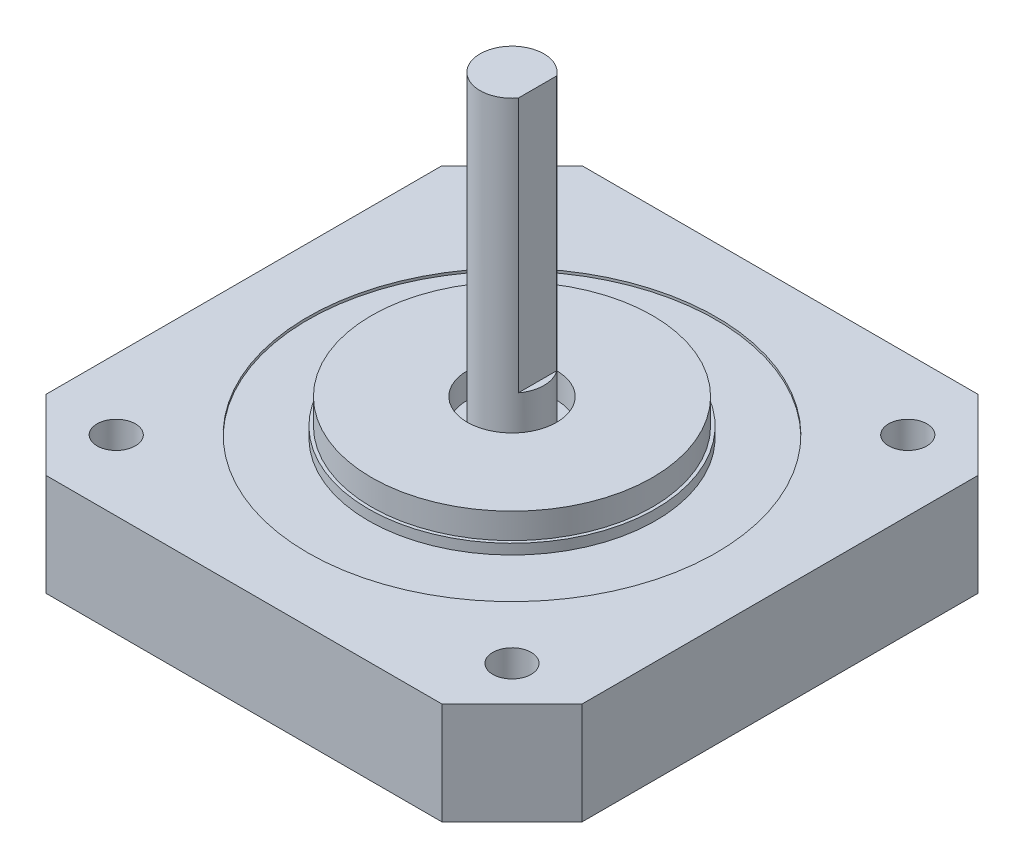
ISO-10303-21;
HEADER;
FILE_DESCRIPTION(('STEP AP214'),'2;1');
FILE_NAME('part.step','',(''),(''),'','','');
FILE_SCHEMA(('AUTOMOTIVE_DESIGN { 1 0 10303 214 1 1 1 1 }'));
ENDSEC;
DATA;
#1=APPLICATION_CONTEXT('core data for automotive mechanical design processes');
#2=APPLICATION_PROTOCOL_DEFINITION('international standard','automotive_design',2000,#1);
#3=PRODUCT_CONTEXT('',#1,'mechanical');
#4=PRODUCT('Part','Part','',(#3));
#5=PRODUCT_RELATED_PRODUCT_CATEGORY('part','',(#4));
#6=PRODUCT_DEFINITION_FORMATION('','',#4);
#7=PRODUCT_DEFINITION_CONTEXT('part definition',#1,'design');
#8=PRODUCT_DEFINITION('design','',#6,#7);
#9=PRODUCT_DEFINITION_SHAPE('','',#8);
#10=(LENGTH_UNIT() NAMED_UNIT(*) SI_UNIT(.MILLI.,.METRE.));
#11=(NAMED_UNIT(*) PLANE_ANGLE_UNIT() SI_UNIT($,.RADIAN.));
#12=(NAMED_UNIT(*) SI_UNIT($,.STERADIAN.) SOLID_ANGLE_UNIT());
#13=UNCERTAINTY_MEASURE_WITH_UNIT(LENGTH_MEASURE(1.E-05),#10,'distance_accuracy_value','');
#14=(GEOMETRIC_REPRESENTATION_CONTEXT(3) GLOBAL_UNCERTAINTY_ASSIGNED_CONTEXT((#13)) GLOBAL_UNIT_ASSIGNED_CONTEXT((#10,
#11,#12)) REPRESENTATION_CONTEXT('',''));
#15=CARTESIAN_POINT('',(0.,0.,0.));
#16=DIRECTION('',(0.,0.,1.));
#17=DIRECTION('',(1.,0.,0.));
#18=AXIS2_PLACEMENT_3D('',#15,#16,#17);
#19=CARTESIAN_POINT('',(-15.5,8.,15.5));
#20=DIRECTION('',(0.,-1.,0.));
#21=DIRECTION('',(0.,0.,-1.));
#22=AXIS2_PLACEMENT_3D('',#19,#20,#21);
#23=CYLINDRICAL_SURFACE('',#22,1.5);
#24=CARTESIAN_POINT('',(-15.5,8.,15.5));
#25=DIRECTION('',(0.,-1.,0.));
#26=DIRECTION('',(0.,0.,1.));
#27=AXIS2_PLACEMENT_3D('',#24,#25,#26);
#28=CIRCLE('',#27,1.5);
#29=CARTESIAN_POINT('',(-15.5,8.,17.));
#30=VERTEX_POINT('',#29);
#31=EDGE_CURVE('E166',#30,#30,#28,.T.);
#32=ORIENTED_EDGE('',*,*,#31,.F.);
#33=EDGE_LOOP('',(#32));
#34=FACE_BOUND('',#33,.T.);
#35=CARTESIAN_POINT('',(-15.5,1.,15.5));
#36=DIRECTION('',(0.,-1.,0.));
#37=DIRECTION('',(0.,0.,-1.));
#38=AXIS2_PLACEMENT_3D('',#35,#36,#37);
#39=CIRCLE('',#38,1.5);
#40=CARTESIAN_POINT('',(-15.5,1.,14.));
#41=VERTEX_POINT('',#40);
#42=EDGE_CURVE('E11',#41,#41,#39,.F.);
#43=ORIENTED_EDGE('',*,*,#42,.F.);
#44=EDGE_LOOP('',(#43));
#45=FACE_BOUND('',#44,.T.);
#46=ADVANCED_FACE('F35',(#34,#45),#23,.F.);
#47=CARTESIAN_POINT('',(15.5,8.,-15.5));
#48=DIRECTION('',(0.,-1.,0.));
#49=DIRECTION('',(0.,0.,-1.));
#50=AXIS2_PLACEMENT_3D('',#47,#48,#49);
#51=CYLINDRICAL_SURFACE('',#50,1.5);
#52=CARTESIAN_POINT('',(15.5,8.,-15.5));
#53=DIRECTION('',(0.,-1.,0.));
#54=DIRECTION('',(0.,0.,1.));
#55=AXIS2_PLACEMENT_3D('',#52,#53,#54);
#56=CIRCLE('',#55,1.5);
#57=CARTESIAN_POINT('',(15.5,8.,-14.));
#58=VERTEX_POINT('',#57);
#59=EDGE_CURVE('E167',#58,#58,#56,.T.);
#60=ORIENTED_EDGE('',*,*,#59,.F.);
#61=EDGE_LOOP('',(#60));
#62=FACE_BOUND('',#61,.T.);
#63=CARTESIAN_POINT('',(15.5,1.,-15.5));
#64=DIRECTION('',(0.,-1.,0.));
#65=DIRECTION('',(0.,0.,-1.));
#66=AXIS2_PLACEMENT_3D('',#63,#64,#65);
#67=CIRCLE('',#66,1.5);
#68=CARTESIAN_POINT('',(15.5,1.,-17.));
#69=VERTEX_POINT('',#68);
#70=EDGE_CURVE('E43',#69,#69,#67,.F.);
#71=ORIENTED_EDGE('',*,*,#70,.F.);
#72=EDGE_LOOP('',(#71));
#73=FACE_BOUND('',#72,.T.);
#74=ADVANCED_FACE('F241',(#62,#73),#51,.F.);
#75=CARTESIAN_POINT('',(-15.5,8.,-15.5));
#76=DIRECTION('',(0.,-1.,0.));
#77=DIRECTION('',(0.,0.,-1.));
#78=AXIS2_PLACEMENT_3D('',#75,#76,#77);
#79=CYLINDRICAL_SURFACE('',#78,1.5);
#80=CARTESIAN_POINT('',(-15.5,8.,-15.5));
#81=DIRECTION('',(0.,-1.,0.));
#82=DIRECTION('',(0.,0.,-1.));
#83=AXIS2_PLACEMENT_3D('',#80,#81,#82);
#84=CIRCLE('',#83,1.5);
#85=CARTESIAN_POINT('',(-15.5,8.,-17.));
#86=VERTEX_POINT('',#85);
#87=EDGE_CURVE('E170',#86,#86,#84,.T.);
#88=ORIENTED_EDGE('',*,*,#87,.F.);
#89=EDGE_LOOP('',(#88));
#90=FACE_BOUND('',#89,.T.);
#91=CARTESIAN_POINT('',(-15.5,1.,-15.5));
#92=DIRECTION('',(0.,-1.,0.));
#93=DIRECTION('',(0.,0.,-1.));
#94=AXIS2_PLACEMENT_3D('',#91,#92,#93);
#95=CIRCLE('',#94,1.5);
#96=CARTESIAN_POINT('',(-15.5,1.,-17.));
#97=VERTEX_POINT('',#96);
#98=EDGE_CURVE('E234',#97,#97,#95,.F.);
#99=ORIENTED_EDGE('',*,*,#98,.F.);
#100=EDGE_LOOP('',(#99));
#101=FACE_BOUND('',#100,.T.);
#102=ADVANCED_FACE('F243',(#90,#101),#79,.F.);
#103=CARTESIAN_POINT('',(15.5,8.,15.5));
#104=DIRECTION('',(0.,-1.,0.));
#105=DIRECTION('',(0.,0.,-1.));
#106=AXIS2_PLACEMENT_3D('',#103,#104,#105);
#107=CYLINDRICAL_SURFACE('',#106,1.5);
#108=CARTESIAN_POINT('',(15.5,8.,15.5));
#109=DIRECTION('',(0.,-1.,0.));
#110=DIRECTION('',(0.,0.,-1.));
#111=AXIS2_PLACEMENT_3D('',#108,#109,#110);
#112=CIRCLE('',#111,1.5);
#113=CARTESIAN_POINT('',(15.5,8.,14.));
#114=VERTEX_POINT('',#113);
#115=EDGE_CURVE('E161',#114,#114,#112,.T.);
#116=ORIENTED_EDGE('',*,*,#115,.F.);
#117=EDGE_LOOP('',(#116));
#118=FACE_BOUND('',#117,.T.);
#119=CARTESIAN_POINT('',(15.5,1.,15.5));
#120=DIRECTION('',(0.,-1.,0.));
#121=DIRECTION('',(0.,0.,-1.));
#122=AXIS2_PLACEMENT_3D('',#119,#120,#121);
#123=CIRCLE('',#122,1.5);
#124=CARTESIAN_POINT('',(15.5,1.,14.));
#125=VERTEX_POINT('',#124);
#126=EDGE_CURVE('E151',#125,#125,#123,.F.);
#127=ORIENTED_EDGE('',*,*,#126,.F.);
#128=EDGE_LOOP('',(#127));
#129=FACE_BOUND('',#128,.T.);
#130=ADVANCED_FACE('F250',(#118,#129),#107,.F.);
#131=CARTESIAN_POINT('',(21.,8.,-21.));
#132=DIRECTION('',(-1.,0.,0.));
#133=DIRECTION('',(0.,0.,1.));
#134=AXIS2_PLACEMENT_3D('',#131,#132,#133);
#135=PLANE('',#134);
#136=DIRECTION('',(0.,0.,-1.));
#137=VECTOR('',#136,1.);
#138=CARTESIAN_POINT('',(21.,0.,-21.));
#139=LINE('',#138,#137);
#140=CARTESIAN_POINT('',(21.,0.,15.5));
#141=VERTEX_POINT('',#140);
#142=CARTESIAN_POINT('',(21.,0.,-15.5));
#143=VERTEX_POINT('',#142);
#144=EDGE_CURVE('E175',#141,#143,#139,.T.);
#145=ORIENTED_EDGE('',*,*,#144,.T.);
#146=DIRECTION('',(0.,1.,0.));
#147=VECTOR('',#146,1.);
#148=CARTESIAN_POINT('',(21.,8.,-15.5));
#149=LINE('',#148,#147);
#150=CARTESIAN_POINT('',(21.,8.,-15.5));
#151=VERTEX_POINT('',#150);
#152=EDGE_CURVE('E226',#143,#151,#149,.T.);
#153=ORIENTED_EDGE('',*,*,#152,.T.);
#154=DIRECTION('',(0.,0.,-1.));
#155=VECTOR('',#154,1.);
#156=CARTESIAN_POINT('',(21.,8.,-21.));
#157=LINE('',#156,#155);
#158=CARTESIAN_POINT('',(21.,8.,15.5));
#159=VERTEX_POINT('',#158);
#160=EDGE_CURVE('E176',#159,#151,#157,.T.);
#161=ORIENTED_EDGE('',*,*,#160,.F.);
#162=DIRECTION('',(0.,-1.,0.));
#163=VECTOR('',#162,1.);
#164=CARTESIAN_POINT('',(21.,8.,15.5));
#165=LINE('',#164,#163);
#166=EDGE_CURVE('E223',#159,#141,#165,.T.);
#167=ORIENTED_EDGE('',*,*,#166,.T.);
#168=EDGE_LOOP('',(#145,#153,#161,#167));
#169=FACE_BOUND('',#168,.T.);
#170=ADVANCED_FACE('F278',(#169),#135,.F.);
#171=CARTESIAN_POINT('',(-21.,8.,-21.));
#172=DIRECTION('',(0.,0.,1.));
#173=DIRECTION('',(1.,0.,0.));
#174=AXIS2_PLACEMENT_3D('',#171,#172,#173);
#175=PLANE('',#174);
#176=DIRECTION('',(-1.,0.,0.));
#177=VECTOR('',#176,1.);
#178=CARTESIAN_POINT('',(-21.,0.,-21.));
#179=LINE('',#178,#177);
#180=CARTESIAN_POINT('',(15.5,0.,-21.));
#181=VERTEX_POINT('',#180);
#182=CARTESIAN_POINT('',(-15.5,0.,-21.));
#183=VERTEX_POINT('',#182);
#184=EDGE_CURVE('E191',#181,#183,#179,.T.);
#185=ORIENTED_EDGE('',*,*,#184,.T.);
#186=DIRECTION('',(0.,1.,0.));
#187=VECTOR('',#186,1.);
#188=CARTESIAN_POINT('',(-15.5,8.,-21.));
#189=LINE('',#188,#187);
#190=CARTESIAN_POINT('',(-15.5,8.,-21.));
#191=VERTEX_POINT('',#190);
#192=EDGE_CURVE('E213',#183,#191,#189,.T.);
#193=ORIENTED_EDGE('',*,*,#192,.T.);
#194=DIRECTION('',(-1.,0.,0.));
#195=VECTOR('',#194,1.);
#196=CARTESIAN_POINT('',(-21.,8.,-21.));
#197=LINE('',#196,#195);
#198=CARTESIAN_POINT('',(15.5,8.,-21.));
#199=VERTEX_POINT('',#198);
#200=EDGE_CURVE('E179',#199,#191,#197,.T.);
#201=ORIENTED_EDGE('',*,*,#200,.F.);
#202=DIRECTION('',(0.,-1.,0.));
#203=VECTOR('',#202,1.);
#204=CARTESIAN_POINT('',(15.5,8.,-21.));
#205=LINE('',#204,#203);
#206=EDGE_CURVE('E210',#199,#181,#205,.T.);
#207=ORIENTED_EDGE('',*,*,#206,.T.);
#208=EDGE_LOOP('',(#185,#193,#201,#207));
#209=FACE_BOUND('',#208,.T.);
#210=ADVANCED_FACE('F274',(#209),#175,.F.);
#211=CARTESIAN_POINT('',(-21.,8.,-21.));
#212=DIRECTION('',(1.,0.,0.));
#213=DIRECTION('',(0.,0.,-1.));
#214=AXIS2_PLACEMENT_3D('',#211,#212,#213);
#215=PLANE('',#214);
#216=DIRECTION('',(0.,0.,1.));
#217=VECTOR('',#216,1.);
#218=CARTESIAN_POINT('',(-21.,8.,-21.));
#219=LINE('',#218,#217);
#220=CARTESIAN_POINT('',(-21.,8.,-15.5));
#221=VERTEX_POINT('',#220);
#222=CARTESIAN_POINT('',(-21.,8.,15.5));
#223=VERTEX_POINT('',#222);
#224=EDGE_CURVE('E183',#221,#223,#219,.T.);
#225=ORIENTED_EDGE('',*,*,#224,.F.);
#226=DIRECTION('',(0.,-1.,0.));
#227=VECTOR('',#226,1.);
#228=CARTESIAN_POINT('',(-21.,8.,-15.5));
#229=LINE('',#228,#227);
#230=CARTESIAN_POINT('',(-21.,0.,-15.5));
#231=VERTEX_POINT('',#230);
#232=EDGE_CURVE('E199',#221,#231,#229,.T.);
#233=ORIENTED_EDGE('',*,*,#232,.T.);
#234=DIRECTION('',(0.,0.,1.));
#235=VECTOR('',#234,1.);
#236=CARTESIAN_POINT('',(-21.,0.,-21.));
#237=LINE('',#236,#235);
#238=CARTESIAN_POINT('',(-21.,0.,15.5));
#239=VERTEX_POINT('',#238);
#240=EDGE_CURVE('E194',#231,#239,#237,.T.);
#241=ORIENTED_EDGE('',*,*,#240,.T.);
#242=DIRECTION('',(0.,1.,0.));
#243=VECTOR('',#242,1.);
#244=CARTESIAN_POINT('',(-21.,8.,15.5));
#245=LINE('',#244,#243);
#246=EDGE_CURVE('E188',#239,#223,#245,.T.);
#247=ORIENTED_EDGE('',*,*,#246,.T.);
#248=EDGE_LOOP('',(#225,#233,#241,#247));
#249=FACE_BOUND('',#248,.T.);
#250=ADVANCED_FACE('F271',(#249),#215,.F.);
#251=CARTESIAN_POINT('',(-21.,8.,21.));
#252=DIRECTION('',(0.,0.,-1.));
#253=DIRECTION('',(-1.,0.,0.));
#254=AXIS2_PLACEMENT_3D('',#251,#252,#253);
#255=PLANE('',#254);
#256=DIRECTION('',(1.,0.,0.));
#257=VECTOR('',#256,1.);
#258=CARTESIAN_POINT('',(-21.,0.,21.));
#259=LINE('',#258,#257);
#260=CARTESIAN_POINT('',(-15.5,0.,21.));
#261=VERTEX_POINT('',#260);
#262=CARTESIAN_POINT('',(15.5,0.,21.));
#263=VERTEX_POINT('',#262);
#264=EDGE_CURVE('E180',#261,#263,#259,.T.);
#265=ORIENTED_EDGE('',*,*,#264,.T.);
#266=DIRECTION('',(0.,1.,0.));
#267=VECTOR('',#266,1.);
#268=CARTESIAN_POINT('',(15.5,8.,21.));
#269=LINE('',#268,#267);
#270=CARTESIAN_POINT('',(15.5,8.,21.));
#271=VERTEX_POINT('',#270);
#272=EDGE_CURVE('E58',#263,#271,#269,.T.);
#273=ORIENTED_EDGE('',*,*,#272,.T.);
#274=DIRECTION('',(1.,0.,0.));
#275=VECTOR('',#274,1.);
#276=CARTESIAN_POINT('',(-21.,8.,21.));
#277=LINE('',#276,#275);
#278=CARTESIAN_POINT('',(-15.5,8.,21.));
#279=VERTEX_POINT('',#278);
#280=EDGE_CURVE('E186',#279,#271,#277,.T.);
#281=ORIENTED_EDGE('',*,*,#280,.F.);
#282=DIRECTION('',(0.,-1.,0.));
#283=VECTOR('',#282,1.);
#284=CARTESIAN_POINT('',(-15.5,8.,21.));
#285=LINE('',#284,#283);
#286=EDGE_CURVE('E228',#279,#261,#285,.T.);
#287=ORIENTED_EDGE('',*,*,#286,.T.);
#288=EDGE_LOOP('',(#265,#273,#281,#287));
#289=FACE_BOUND('',#288,.T.);
#290=ADVANCED_FACE('F263',(#289),#255,.F.);
#291=CARTESIAN_POINT('',(0.,8.,0.));
#292=DIRECTION('',(0.,1.,0.));
#293=DIRECTION('',(0.,0.,1.));
#294=AXIS2_PLACEMENT_3D('',#291,#292,#293);
#295=PLANE('',#294);
#296=CARTESIAN_POINT('',(0.,8.,0.));
#297=DIRECTION('',(0.,1.,0.));
#298=DIRECTION('',(0.,0.,1.));
#299=AXIS2_PLACEMENT_3D('',#296,#297,#298);
#300=CIRCLE('',#299,16.);
#301=CARTESIAN_POINT('',(0.,8.,16.));
#302=VERTEX_POINT('',#301);
#303=EDGE_CURVE('E155',#302,#302,#300,.T.);
#304=ORIENTED_EDGE('',*,*,#303,.F.);
#305=EDGE_LOOP('',(#304));
#306=FACE_BOUND('',#305,.T.);
#307=ORIENTED_EDGE('',*,*,#59,.T.);
#308=EDGE_LOOP('',(#307));
#309=FACE_BOUND('',#308,.T.);
#310=ORIENTED_EDGE('',*,*,#31,.T.);
#311=EDGE_LOOP('',(#310));
#312=FACE_BOUND('',#311,.T.);
#313=ORIENTED_EDGE('',*,*,#115,.T.);
#314=EDGE_LOOP('',(#313));
#315=FACE_BOUND('',#314,.T.);
#316=ORIENTED_EDGE('',*,*,#87,.T.);
#317=EDGE_LOOP('',(#316));
#318=FACE_BOUND('',#317,.T.);
#319=ORIENTED_EDGE('',*,*,#200,.T.);
#320=DIRECTION('',(0.707106781186549,0.,-0.707106781186546));
#321=VECTOR('',#320,1.);
#322=CARTESIAN_POINT('',(-18.25,8.,-18.25));
#323=LINE('',#322,#321);
#324=EDGE_CURVE('E221',#191,#221,#323,.F.);
#325=ORIENTED_EDGE('',*,*,#324,.T.);
#326=ORIENTED_EDGE('',*,*,#224,.T.);
#327=DIRECTION('',(-0.707106781186546,0.,-0.707106781186549));
#328=VECTOR('',#327,1.);
#329=CARTESIAN_POINT('',(-18.25,8.,18.25));
#330=LINE('',#329,#328);
#331=EDGE_CURVE('E215',#223,#279,#330,.F.);
#332=ORIENTED_EDGE('',*,*,#331,.T.);
#333=ORIENTED_EDGE('',*,*,#280,.T.);
#334=DIRECTION('',(-0.707106781186549,0.,0.707106781186546));
#335=VECTOR('',#334,1.);
#336=CARTESIAN_POINT('',(18.25,8.,18.25));
#337=LINE('',#336,#335);
#338=EDGE_CURVE('E217',#271,#159,#337,.F.);
#339=ORIENTED_EDGE('',*,*,#338,.T.);
#340=ORIENTED_EDGE('',*,*,#160,.T.);
#341=DIRECTION('',(0.707106781186546,0.,0.707106781186549));
#342=VECTOR('',#341,1.);
#343=CARTESIAN_POINT('',(18.25,8.,-18.25));
#344=LINE('',#343,#342);
#345=EDGE_CURVE('E219',#151,#199,#344,.F.);
#346=ORIENTED_EDGE('',*,*,#345,.T.);
#347=EDGE_LOOP('',(#319,#325,#326,#332,#333,#339,#340,#346));
#348=FACE_BOUND('',#347,.T.);
#349=ADVANCED_FACE('F259',(#306,#309,#312,#315,#318,#348),#295,.T.);
#350=CARTESIAN_POINT('',(0.,0.,0.));
#351=DIRECTION('',(0.,1.,0.));
#352=DIRECTION('',(0.,0.,1.));
#353=AXIS2_PLACEMENT_3D('',#350,#351,#352);
#354=PLANE('',#353);
#355=ORIENTED_EDGE('',*,*,#240,.F.);
#356=DIRECTION('',(-0.707106781186549,0.,0.707106781186546));
#357=VECTOR('',#356,1.);
#358=CARTESIAN_POINT('',(-21.,0.,-15.5));
#359=LINE('',#358,#357);
#360=EDGE_CURVE('E208',#231,#183,#359,.F.);
#361=ORIENTED_EDGE('',*,*,#360,.T.);
#362=ORIENTED_EDGE('',*,*,#184,.F.);
#363=DIRECTION('',(-0.707106781186546,0.,-0.707106781186549));
#364=VECTOR('',#363,1.);
#365=CARTESIAN_POINT('',(15.5,0.,-21.));
#366=LINE('',#365,#364);
#367=EDGE_CURVE('E206',#181,#143,#366,.F.);
#368=ORIENTED_EDGE('',*,*,#367,.T.);
#369=ORIENTED_EDGE('',*,*,#144,.F.);
#370=DIRECTION('',(0.707106781186549,0.,-0.707106781186546));
#371=VECTOR('',#370,1.);
#372=CARTESIAN_POINT('',(21.,0.,15.5));
#373=LINE('',#372,#371);
#374=EDGE_CURVE('E204',#141,#263,#373,.F.);
#375=ORIENTED_EDGE('',*,*,#374,.T.);
#376=ORIENTED_EDGE('',*,*,#264,.F.);
#377=DIRECTION('',(0.707106781186546,0.,0.707106781186549));
#378=VECTOR('',#377,1.);
#379=CARTESIAN_POINT('',(-15.5,0.,21.));
#380=LINE('',#379,#378);
#381=EDGE_CURVE('E202',#261,#239,#380,.F.);
#382=ORIENTED_EDGE('',*,*,#381,.T.);
#383=EDGE_LOOP('',(#355,#361,#362,#368,#369,#375,#376,#382));
#384=FACE_BOUND('',#383,.T.);
#385=ADVANCED_FACE('F262',(#384),#354,.F.);
#386=CARTESIAN_POINT('',(-21.,8.,-15.5));
#387=DIRECTION('',(0.707106781186546,0.,0.707106781186549));
#388=DIRECTION('',(0.,-1.,0.));
#389=AXIS2_PLACEMENT_3D('',#386,#387,#388);
#390=PLANE('',#389);
#391=ORIENTED_EDGE('',*,*,#324,.F.);
#392=ORIENTED_EDGE('',*,*,#192,.F.);
#393=ORIENTED_EDGE('',*,*,#360,.F.);
#394=ORIENTED_EDGE('',*,*,#232,.F.);
#395=EDGE_LOOP('',(#391,#392,#393,#394));
#396=FACE_BOUND('',#395,.T.);
#397=ADVANCED_FACE('F267',(#396),#390,.F.);
#398=CARTESIAN_POINT('',(15.5,8.,-21.));
#399=DIRECTION('',(-0.707106781186549,0.,0.707106781186546));
#400=DIRECTION('',(0.,-1.,0.));
#401=AXIS2_PLACEMENT_3D('',#398,#399,#400);
#402=PLANE('',#401);
#403=ORIENTED_EDGE('',*,*,#345,.F.);
#404=ORIENTED_EDGE('',*,*,#152,.F.);
#405=ORIENTED_EDGE('',*,*,#367,.F.);
#406=ORIENTED_EDGE('',*,*,#206,.F.);
#407=EDGE_LOOP('',(#403,#404,#405,#406));
#408=FACE_BOUND('',#407,.T.);
#409=ADVANCED_FACE('F285',(#408),#402,.F.);
#410=CARTESIAN_POINT('',(21.,8.,15.5));
#411=DIRECTION('',(-0.707106781186546,0.,-0.707106781186549));
#412=DIRECTION('',(0.,-1.,0.));
#413=AXIS2_PLACEMENT_3D('',#410,#411,#412);
#414=PLANE('',#413);
#415=ORIENTED_EDGE('',*,*,#338,.F.);
#416=ORIENTED_EDGE('',*,*,#272,.F.);
#417=ORIENTED_EDGE('',*,*,#374,.F.);
#418=ORIENTED_EDGE('',*,*,#166,.F.);
#419=EDGE_LOOP('',(#415,#416,#417,#418));
#420=FACE_BOUND('',#419,.T.);
#421=ADVANCED_FACE('F288',(#420),#414,.F.);
#422=CARTESIAN_POINT('',(-15.5,8.,21.));
#423=DIRECTION('',(0.707106781186549,0.,-0.707106781186546));
#424=DIRECTION('',(0.,-1.,0.));
#425=AXIS2_PLACEMENT_3D('',#422,#423,#424);
#426=PLANE('',#425);
#427=ORIENTED_EDGE('',*,*,#331,.F.);
#428=ORIENTED_EDGE('',*,*,#246,.F.);
#429=ORIENTED_EDGE('',*,*,#381,.F.);
#430=ORIENTED_EDGE('',*,*,#286,.F.);
#431=EDGE_LOOP('',(#427,#428,#429,#430));
#432=FACE_BOUND('',#431,.T.);
#433=ADVANCED_FACE('F37',(#432),#426,.F.);
#434=CARTESIAN_POINT('',(0.,7.8,0.));
#435=DIRECTION('',(0.,1.,0.));
#436=DIRECTION('',(0.,0.,1.));
#437=AXIS2_PLACEMENT_3D('',#434,#435,#436);
#438=CYLINDRICAL_SURFACE('',#437,16.);
#439=CARTESIAN_POINT('',(0.,7.8,0.));
#440=DIRECTION('',(0.,1.,0.));
#441=DIRECTION('',(0.,0.,1.));
#442=AXIS2_PLACEMENT_3D('',#439,#440,#441);
#443=CIRCLE('',#442,16.);
#444=CARTESIAN_POINT('',(0.,7.8,16.));
#445=VERTEX_POINT('',#444);
#446=EDGE_CURVE('E158',#445,#445,#443,.T.);
#447=ORIENTED_EDGE('',*,*,#446,.F.);
#448=EDGE_LOOP('',(#447));
#449=FACE_BOUND('',#448,.T.);
#450=ORIENTED_EDGE('',*,*,#303,.T.);
#451=EDGE_LOOP('',(#450));
#452=FACE_BOUND('',#451,.T.);
#453=ADVANCED_FACE('F295',(#449,#452),#438,.F.);
#454=CARTESIAN_POINT('',(0.,7.8,0.));
#455=DIRECTION('',(0.,1.,0.));
#456=DIRECTION('',(0.,0.,1.));
#457=AXIS2_PLACEMENT_3D('',#454,#455,#456);
#458=PLANE('',#457);
#459=CARTESIAN_POINT('',(0.,7.8,0.));
#460=DIRECTION('',(0.,1.,0.));
#461=DIRECTION('',(0.,0.,1.));
#462=AXIS2_PLACEMENT_3D('',#459,#460,#461);
#463=CIRCLE('',#462,11.25);
#464=CARTESIAN_POINT('',(0.,7.8,11.25));
#465=VERTEX_POINT('',#464);
#466=EDGE_CURVE('E147',#465,#465,#463,.T.);
#467=ORIENTED_EDGE('',*,*,#466,.F.);
#468=EDGE_LOOP('',(#467));
#469=FACE_BOUND('',#468,.T.);
#470=ORIENTED_EDGE('',*,*,#446,.T.);
#471=EDGE_LOOP('',(#470));
#472=FACE_BOUND('',#471,.T.);
#473=ADVANCED_FACE('F319',(#469,#472),#458,.T.);
#474=CARTESIAN_POINT('',(0.,8.6,0.));
#475=DIRECTION('',(0.,-1.,0.));
#476=DIRECTION('',(0.,0.,-1.));
#477=AXIS2_PLACEMENT_3D('',#474,#475,#476);
#478=CYLINDRICAL_SURFACE('',#477,11.25);
#479=CARTESIAN_POINT('',(0.,8.6,0.));
#480=DIRECTION('',(0.,1.,0.));
#481=DIRECTION('',(0.,0.,1.));
#482=AXIS2_PLACEMENT_3D('',#479,#480,#481);
#483=CIRCLE('',#482,11.25);
#484=CARTESIAN_POINT('',(0.,8.6,11.25));
#485=VERTEX_POINT('',#484);
#486=EDGE_CURVE('E152',#485,#485,#483,.T.);
#487=ORIENTED_EDGE('',*,*,#486,.F.);
#488=EDGE_LOOP('',(#487));
#489=FACE_BOUND('',#488,.T.);
#490=ORIENTED_EDGE('',*,*,#466,.T.);
#491=EDGE_LOOP('',(#490));
#492=FACE_BOUND('',#491,.T.);
#493=ADVANCED_FACE('F324',(#489,#492),#478,.T.);
#494=CARTESIAN_POINT('',(0.,8.6,0.));
#495=DIRECTION('',(0.,1.,0.));
#496=DIRECTION('',(0.,0.,1.));
#497=AXIS2_PLACEMENT_3D('',#494,#495,#496);
#498=PLANE('',#497);
#499=CARTESIAN_POINT('',(0.,8.6,0.));
#500=DIRECTION('',(0.,1.,0.));
#501=DIRECTION('',(0.,0.,1.));
#502=AXIS2_PLACEMENT_3D('',#499,#500,#501);
#503=CIRCLE('',#502,11.);
#504=CARTESIAN_POINT('',(0.,8.6,11.));
#505=VERTEX_POINT('',#504);
#506=EDGE_CURVE('E148',#505,#505,#503,.T.);
#507=ORIENTED_EDGE('',*,*,#506,.F.);
#508=EDGE_LOOP('',(#507));
#509=FACE_BOUND('',#508,.T.);
#510=ORIENTED_EDGE('',*,*,#486,.T.);
#511=EDGE_LOOP('',(#510));
#512=FACE_BOUND('',#511,.T.);
#513=ADVANCED_FACE('F332',(#509,#512),#498,.T.);
#514=CARTESIAN_POINT('',(0.,10.6,0.));
#515=DIRECTION('',(0.,-1.,0.));
#516=DIRECTION('',(0.,0.,-1.));
#517=AXIS2_PLACEMENT_3D('',#514,#515,#516);
#518=CYLINDRICAL_SURFACE('',#517,11.);
#519=CARTESIAN_POINT('',(0.,10.6,0.));
#520=DIRECTION('',(0.,1.,0.));
#521=DIRECTION('',(0.,0.,1.));
#522=AXIS2_PLACEMENT_3D('',#519,#520,#521);
#523=CIRCLE('',#522,11.);
#524=CARTESIAN_POINT('',(0.,10.6,11.));
#525=VERTEX_POINT('',#524);
#526=EDGE_CURVE('E142',#525,#525,#523,.T.);
#527=ORIENTED_EDGE('',*,*,#526,.F.);
#528=EDGE_LOOP('',(#527));
#529=FACE_BOUND('',#528,.T.);
#530=ORIENTED_EDGE('',*,*,#506,.T.);
#531=EDGE_LOOP('',(#530));
#532=FACE_BOUND('',#531,.T.);
#533=ADVANCED_FACE('F336',(#529,#532),#518,.T.);
#534=CARTESIAN_POINT('',(0.,10.6,0.));
#535=DIRECTION('',(0.,1.,0.));
#536=DIRECTION('',(0.,0.,1.));
#537=AXIS2_PLACEMENT_3D('',#534,#535,#536);
#538=PLANE('',#537);
#539=CARTESIAN_POINT('',(0.,10.6,0.));
#540=DIRECTION('',(0.,1.,0.));
#541=DIRECTION('',(0.,0.,1.));
#542=AXIS2_PLACEMENT_3D('',#539,#540,#541);
#543=CIRCLE('',#542,3.5);
#544=CARTESIAN_POINT('',(0.,10.6,3.5));
#545=VERTEX_POINT('',#544);
#546=EDGE_CURVE('E139',#545,#545,#543,.T.);
#547=ORIENTED_EDGE('',*,*,#546,.F.);
#548=EDGE_LOOP('',(#547));
#549=FACE_BOUND('',#548,.T.);
#550=ORIENTED_EDGE('',*,*,#526,.T.);
#551=EDGE_LOOP('',(#550));
#552=FACE_BOUND('',#551,.T.);
#553=ADVANCED_FACE('F340',(#549,#552),#538,.T.);
#554=CARTESIAN_POINT('',(0.,10.6,0.));
#555=DIRECTION('',(0.,-1.,0.));
#556=DIRECTION('',(0.,0.,-1.));
#557=AXIS2_PLACEMENT_3D('',#554,#555,#556);
#558=CYLINDRICAL_SURFACE('',#557,3.5);
#559=ORIENTED_EDGE('',*,*,#546,.T.);
#560=EDGE_LOOP('',(#559));
#561=FACE_BOUND('',#560,.T.);
#562=CARTESIAN_POINT('',(0.,8.6,0.));
#563=DIRECTION('',(0.,1.,0.));
#564=DIRECTION('',(0.,0.,1.));
#565=AXIS2_PLACEMENT_3D('',#562,#563,#564);
#566=CIRCLE('',#565,3.5);
#567=CARTESIAN_POINT('',(0.,8.6,3.5));
#568=VERTEX_POINT('',#567);
#569=EDGE_CURVE('E136',#568,#568,#566,.T.);
#570=ORIENTED_EDGE('',*,*,#569,.F.);
#571=EDGE_LOOP('',(#570));
#572=FACE_BOUND('',#571,.T.);
#573=ADVANCED_FACE('F344',(#561,#572),#558,.F.);
#574=CARTESIAN_POINT('',(0.,8.6,0.));
#575=DIRECTION('',(0.,1.,0.));
#576=DIRECTION('',(0.,0.,1.));
#577=AXIS2_PLACEMENT_3D('',#574,#575,#576);
#578=PLANE('',#577);
#579=CARTESIAN_POINT('',(0.,8.6,0.));
#580=DIRECTION('',(0.,1.,0.));
#581=DIRECTION('',(0.,0.,1.));
#582=AXIS2_PLACEMENT_3D('',#579,#580,#581);
#583=CIRCLE('',#582,2.5);
#584=CARTESIAN_POINT('',(0.,8.6,2.5));
#585=VERTEX_POINT('',#584);
#586=EDGE_CURVE('E131',#585,#585,#583,.T.);
#587=ORIENTED_EDGE('',*,*,#586,.F.);
#588=EDGE_LOOP('',(#587));
#589=FACE_BOUND('',#588,.T.);
#590=ORIENTED_EDGE('',*,*,#569,.T.);
#591=EDGE_LOOP('',(#590));
#592=FACE_BOUND('',#591,.T.);
#593=ADVANCED_FACE('F348',(#589,#592),#578,.T.);
#594=CARTESIAN_POINT('',(0.,32.6,0.));
#595=DIRECTION('',(0.,-1.,0.));
#596=DIRECTION('',(0.,0.,-1.));
#597=AXIS2_PLACEMENT_3D('',#594,#595,#596);
#598=CYLINDRICAL_SURFACE('',#597,2.5);
#599=CARTESIAN_POINT('',(0.,32.6,0.));
#600=DIRECTION('',(0.,1.,0.));
#601=DIRECTION('',(0.,0.,1.));
#602=AXIS2_PLACEMENT_3D('',#599,#600,#601);
#603=CIRCLE('',#602,2.5);
#604=CARTESIAN_POINT('',(2.,32.6,-1.5));
#605=VERTEX_POINT('',#604);
#606=CARTESIAN_POINT('',(2.,32.6,1.5));
#607=VERTEX_POINT('',#606);
#608=EDGE_CURVE('E129',#605,#607,#603,.T.);
#609=ORIENTED_EDGE('',*,*,#608,.F.);
#610=DIRECTION('',(0.,1.,0.));
#611=VECTOR('',#610,1.);
#612=CARTESIAN_POINT('',(2.,12.6,-1.5));
#613=LINE('',#612,#611);
#614=CARTESIAN_POINT('',(2.,12.6,-1.5));
#615=VERTEX_POINT('',#614);
#616=EDGE_CURVE('E50',#615,#605,#613,.T.);
#617=ORIENTED_EDGE('',*,*,#616,.F.);
#618=CARTESIAN_POINT('',(0.,12.6,0.));
#619=DIRECTION('',(0.,1.,0.));
#620=DIRECTION('',(0.,0.,-1.));
#621=AXIS2_PLACEMENT_3D('',#618,#619,#620);
#622=CIRCLE('',#621,2.50000000000001);
#623=CARTESIAN_POINT('',(2.,12.6,1.5));
#624=VERTEX_POINT('',#623);
#625=EDGE_CURVE('E115',#624,#615,#622,.T.);
#626=ORIENTED_EDGE('',*,*,#625,.F.);
#627=DIRECTION('',(0.,1.,0.));
#628=VECTOR('',#627,1.);
#629=CARTESIAN_POINT('',(2.,12.6,1.5));
#630=LINE('',#629,#628);
#631=EDGE_CURVE('E123',#624,#607,#630,.T.);
#632=ORIENTED_EDGE('',*,*,#631,.T.);
#633=EDGE_LOOP('',(#609,#617,#626,#632));
#634=FACE_BOUND('',#633,.T.);
#635=ORIENTED_EDGE('',*,*,#586,.T.);
#636=EDGE_LOOP('',(#635));
#637=FACE_BOUND('',#636,.T.);
#638=ADVANCED_FACE('F126',(#634,#637),#598,.T.);
#639=CARTESIAN_POINT('',(0.,32.6,0.));
#640=DIRECTION('',(0.,1.,0.));
#641=DIRECTION('',(0.,0.,1.));
#642=AXIS2_PLACEMENT_3D('',#639,#640,#641);
#643=PLANE('',#642);
#644=DIRECTION('',(0.,0.,1.));
#645=VECTOR('',#644,1.);
#646=CARTESIAN_POINT('',(2.,32.6,-1.5));
#647=LINE('',#646,#645);
#648=EDGE_CURVE('E120',#605,#607,#647,.T.);
#649=ORIENTED_EDGE('',*,*,#648,.F.);
#650=ORIENTED_EDGE('',*,*,#608,.T.);
#651=EDGE_LOOP('',(#649,#650));
#652=FACE_BOUND('',#651,.T.);
#653=ADVANCED_FACE('F355',(#652),#643,.T.);
#654=CARTESIAN_POINT('',(2.,12.6,-1.5));
#655=DIRECTION('',(-1.,0.,0.));
#656=DIRECTION('',(0.,0.,1.));
#657=AXIS2_PLACEMENT_3D('',#654,#655,#656);
#658=PLANE('',#657);
#659=ORIENTED_EDGE('',*,*,#648,.T.);
#660=ORIENTED_EDGE('',*,*,#631,.F.);
#661=DIRECTION('',(0.,0.,1.));
#662=VECTOR('',#661,1.);
#663=CARTESIAN_POINT('',(2.,12.6,-1.5));
#664=LINE('',#663,#662);
#665=EDGE_CURVE('E117',#615,#624,#664,.T.);
#666=ORIENTED_EDGE('',*,*,#665,.F.);
#667=ORIENTED_EDGE('',*,*,#616,.T.);
#668=EDGE_LOOP('',(#659,#660,#666,#667));
#669=FACE_BOUND('',#668,.T.);
#670=ADVANCED_FACE('F122',(#669),#658,.F.);
#671=CARTESIAN_POINT('',(0.,12.6,0.));
#672=DIRECTION('',(0.,-1.,0.));
#673=DIRECTION('',(0.,0.,-1.));
#674=AXIS2_PLACEMENT_3D('',#671,#672,#673);
#675=PLANE('',#674);
#676=ORIENTED_EDGE('',*,*,#625,.T.);
#677=ORIENTED_EDGE('',*,*,#665,.T.);
#678=EDGE_LOOP('',(#676,#677));
#679=FACE_BOUND('',#678,.T.);
#680=ADVANCED_FACE('F116',(#679),#675,.F.);
#681=CARTESIAN_POINT('',(15.5,1.,15.5));
#682=DIRECTION('',(0.,-1.,0.));
#683=DIRECTION('',(0.,0.,-1.));
#684=AXIS2_PLACEMENT_3D('',#681,#682,#683);
#685=PLANE('',#684);
#686=ORIENTED_EDGE('',*,*,#126,.T.);
#687=EDGE_LOOP('',(#686));
#688=FACE_BOUND('',#687,.T.);
#689=ADVANCED_FACE('F363',(#688),#685,.F.);
#690=CARTESIAN_POINT('',(-15.5,1.,-15.5));
#691=DIRECTION('',(0.,-1.,0.));
#692=DIRECTION('',(0.,0.,-1.));
#693=AXIS2_PLACEMENT_3D('',#690,#691,#692);
#694=PLANE('',#693);
#695=ORIENTED_EDGE('',*,*,#98,.T.);
#696=EDGE_LOOP('',(#695));
#697=FACE_BOUND('',#696,.T.);
#698=ADVANCED_FACE('F366',(#697),#694,.F.);
#699=CARTESIAN_POINT('',(15.5,1.,-15.5));
#700=DIRECTION('',(0.,-1.,0.));
#701=DIRECTION('',(0.,0.,-1.));
#702=AXIS2_PLACEMENT_3D('',#699,#700,#701);
#703=PLANE('',#702);
#704=ORIENTED_EDGE('',*,*,#70,.T.);
#705=EDGE_LOOP('',(#704));
#706=FACE_BOUND('',#705,.T.);
#707=ADVANCED_FACE('F239',(#706),#703,.F.);
#708=CARTESIAN_POINT('',(-15.5,1.,15.5));
#709=DIRECTION('',(0.,-1.,0.));
#710=DIRECTION('',(0.,0.,-1.));
#711=AXIS2_PLACEMENT_3D('',#708,#709,#710);
#712=PLANE('',#711);
#713=ORIENTED_EDGE('',*,*,#42,.T.);
#714=EDGE_LOOP('',(#713));
#715=FACE_BOUND('',#714,.T.);
#716=ADVANCED_FACE('F373',(#715),#712,.F.);
#717=CLOSED_SHELL('',(#46,#74,#102,#130,#170,#210,#250,#290,#349,#385,#397,#409,#421,#433,#453,
#473,#493,#513,#533,#553,#573,#593,#638,#653,#670,#680,#689,#698,#707,#716));
#718=MANIFOLD_SOLID_BREP('B2',#717);
#719=ADVANCED_BREP_SHAPE_REPRESENTATION('',(#18,#718),#14);
#720=SHAPE_DEFINITION_REPRESENTATION(#9,#719);
ENDSEC;
END-ISO-10303-21;
